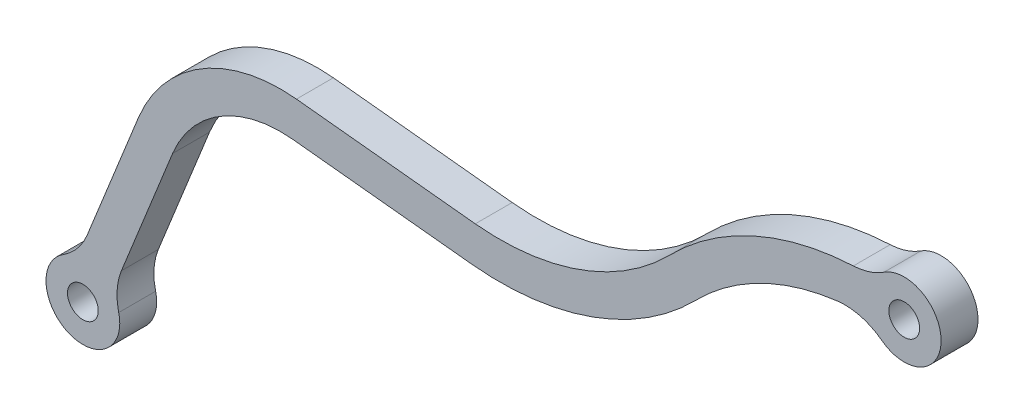
ISO-10303-21;
HEADER;
FILE_DESCRIPTION(('STEP AP214'),'2;1');
FILE_NAME('part.step','',(''),(''),'','','');
FILE_SCHEMA(('AUTOMOTIVE_DESIGN { 1 0 10303 214 1 1 1 1 }'));
ENDSEC;
DATA;
#1=APPLICATION_CONTEXT('core data for automotive mechanical design processes');
#2=APPLICATION_PROTOCOL_DEFINITION('international standard','automotive_design',2000,#1);
#3=PRODUCT_CONTEXT('',#1,'mechanical');
#4=PRODUCT('Part','Part','',(#3));
#5=PRODUCT_RELATED_PRODUCT_CATEGORY('part','',(#4));
#6=PRODUCT_DEFINITION_FORMATION('','',#4);
#7=PRODUCT_DEFINITION_CONTEXT('part definition',#1,'design');
#8=PRODUCT_DEFINITION('design','',#6,#7);
#9=PRODUCT_DEFINITION_SHAPE('','',#8);
#10=(LENGTH_UNIT() NAMED_UNIT(*) SI_UNIT(.MILLI.,.METRE.));
#11=(NAMED_UNIT(*) PLANE_ANGLE_UNIT() SI_UNIT($,.RADIAN.));
#12=(NAMED_UNIT(*) SI_UNIT($,.STERADIAN.) SOLID_ANGLE_UNIT());
#13=UNCERTAINTY_MEASURE_WITH_UNIT(LENGTH_MEASURE(1.E-05),#10,'distance_accuracy_value','');
#14=(GEOMETRIC_REPRESENTATION_CONTEXT(3) GLOBAL_UNCERTAINTY_ASSIGNED_CONTEXT((#13)) GLOBAL_UNIT_ASSIGNED_CONTEXT((#10,
#11,#12)) REPRESENTATION_CONTEXT('',''));
#15=CARTESIAN_POINT('',(0.,0.,0.));
#16=DIRECTION('',(0.,0.,1.));
#17=DIRECTION('',(1.,0.,0.));
#18=AXIS2_PLACEMENT_3D('',#15,#16,#17);
#19=CARTESIAN_POINT('',(64.3610891133232,12.0465142297136,3.));
#20=DIRECTION('',(0.,0.,-1.));
#21=DIRECTION('',(-1.,0.,0.));
#22=AXIS2_PLACEMENT_3D('',#19,#20,#21);
#23=CYLINDRICAL_SURFACE('',#22,19.3674957832383);
#24=CARTESIAN_POINT('',(64.3610891133232,12.0465142297136,0.));
#25=DIRECTION('',(0.,0.,1.));
#26=DIRECTION('',(1.,0.,0.));
#27=AXIS2_PLACEMENT_3D('',#24,#25,#26);
#28=CIRCLE('',#27,19.3674957832383);
#29=CARTESIAN_POINT('',(62.0017364179631,31.2697644172508,0.));
#30=VERTEX_POINT('',#29);
#31=CARTESIAN_POINT('',(50.5184496293153,25.5920383993254,0.));
#32=VERTEX_POINT('',#31);
#33=EDGE_CURVE('E208',#30,#32,#28,.T.);
#34=ORIENTED_EDGE('',*,*,#33,.F.);
#35=DIRECTION('',(0.,0.,-1.));
#36=VECTOR('',#35,1.);
#37=CARTESIAN_POINT('',(62.0017364179631,31.2697644172508,3.));
#38=LINE('',#37,#36);
#39=CARTESIAN_POINT('',(62.0017364179631,31.2697644172508,3.));
#40=VERTEX_POINT('',#39);
#41=EDGE_CURVE('E161',#30,#40,#38,.F.);
#42=ORIENTED_EDGE('',*,*,#41,.T.);
#43=CARTESIAN_POINT('',(64.3610891133232,12.0465142297136,3.));
#44=DIRECTION('',(0.,0.,1.));
#45=DIRECTION('',(1.,0.,0.));
#46=AXIS2_PLACEMENT_3D('',#43,#44,#45);
#47=CIRCLE('',#46,19.3674957832383);
#48=CARTESIAN_POINT('',(50.5184496293153,25.5920383993254,3.));
#49=VERTEX_POINT('',#48);
#50=EDGE_CURVE('E185',#40,#49,#47,.T.);
#51=ORIENTED_EDGE('',*,*,#50,.T.);
#52=DIRECTION('',(0.,0.,-1.));
#53=VECTOR('',#52,1.);
#54=CARTESIAN_POINT('',(50.5184496293153,25.5920383993254,3.));
#55=LINE('',#54,#53);
#56=EDGE_CURVE('E229',#49,#32,#55,.T.);
#57=ORIENTED_EDGE('',*,*,#56,.T.);
#58=EDGE_LOOP('',(#34,#42,#51,#57));
#59=FACE_BOUND('',#58,.T.);
#60=ADVANCED_FACE('F36',(#59),#23,.F.);
#61=CARTESIAN_POINT('',(64.3610891133232,12.0465142297136,3.));
#62=DIRECTION('',(0.,0.,-1.));
#63=DIRECTION('',(-1.,0.,0.));
#64=AXIS2_PLACEMENT_3D('',#61,#62,#63);
#65=CYLINDRICAL_SURFACE('',#64,22.3674957832383);
#66=CARTESIAN_POINT('',(64.3610891133232,12.0465142297136,3.));
#67=DIRECTION('',(0.,0.,1.));
#68=DIRECTION('',(1.,0.,0.));
#69=AXIS2_PLACEMENT_3D('',#66,#67,#68);
#70=CIRCLE('',#69,22.3674957832383);
#71=CARTESIAN_POINT('',(63.3006952292982,34.3888604006936,3.));
#72=VERTEX_POINT('',#71);
#73=CARTESIAN_POINT('',(48.3742427108367,27.6902225406125,3.));
#74=VERTEX_POINT('',#73);
#75=EDGE_CURVE('E187',#72,#74,#70,.T.);
#76=ORIENTED_EDGE('',*,*,#75,.F.);
#77=DIRECTION('',(0.,0.,-1.));
#78=VECTOR('',#77,1.);
#79=CARTESIAN_POINT('',(63.3006952292982,34.3888604006936,3.));
#80=LINE('',#79,#78);
#81=CARTESIAN_POINT('',(63.3006952292982,34.3888604006936,0.));
#82=VERTEX_POINT('',#81);
#83=EDGE_CURVE('E242',#72,#82,#80,.T.);
#84=ORIENTED_EDGE('',*,*,#83,.T.);
#85=CARTESIAN_POINT('',(64.3610891133232,12.0465142297136,0.));
#86=DIRECTION('',(0.,0.,1.));
#87=DIRECTION('',(1.,0.,0.));
#88=AXIS2_PLACEMENT_3D('',#85,#86,#87);
#89=CIRCLE('',#88,22.3674957832383);
#90=CARTESIAN_POINT('',(48.3742427108367,27.6902225406125,0.));
#91=VERTEX_POINT('',#90);
#92=EDGE_CURVE('E210',#82,#91,#89,.T.);
#93=ORIENTED_EDGE('',*,*,#92,.T.);
#94=DIRECTION('',(0.,0.,-1.));
#95=VECTOR('',#94,1.);
#96=CARTESIAN_POINT('',(48.3742427108367,27.6902225406125,3.));
#97=LINE('',#96,#95);
#98=EDGE_CURVE('E226',#74,#91,#97,.T.);
#99=ORIENTED_EDGE('',*,*,#98,.F.);
#100=EDGE_LOOP('',(#76,#84,#93,#99));
#101=FACE_BOUND('',#100,.T.);
#102=ADVANCED_FACE('F287',(#101),#65,.T.);
#103=CARTESIAN_POINT('',(5.16671569963093,15.7549925129079,3.));
#104=DIRECTION('',(0.927645319877807,-0.373462395039715,0.));
#105=DIRECTION('',(0.373462395039715,0.927645319877808,0.));
#106=AXIS2_PLACEMENT_3D('',#103,#104,#105);
#107=PLANE('',#106);
#108=DIRECTION('',(-0.373462395039715,-0.927645319877808,0.));
#109=VECTOR('',#108,1.);
#110=CARTESIAN_POINT('',(5.16671569963093,15.7549925129079,0.));
#111=LINE('',#110,#109);
#112=CARTESIAN_POINT('',(5.16671569963093,15.7549925129079,0.));
#113=VERTEX_POINT('',#112);
#114=CARTESIAN_POINT('',(1.0039127510955,5.41498311953436,0.));
#115=VERTEX_POINT('',#114);
#116=EDGE_CURVE('E196',#113,#115,#111,.T.);
#117=ORIENTED_EDGE('',*,*,#116,.T.);
#118=DIRECTION('',(0.,0.,1.));
#119=VECTOR('',#118,1.);
#120=CARTESIAN_POINT('',(1.0039127510955,5.41498311953436,3.));
#121=LINE('',#120,#119);
#122=CARTESIAN_POINT('',(1.0039127510955,5.41498311953436,3.));
#123=VERTEX_POINT('',#122);
#124=EDGE_CURVE('E57',#115,#123,#121,.T.);
#125=ORIENTED_EDGE('',*,*,#124,.T.);
#126=DIRECTION('',(-0.373462395039715,-0.927645319877808,0.));
#127=VECTOR('',#126,1.);
#128=CARTESIAN_POINT('',(5.16671569963093,15.7549925129079,3.));
#129=LINE('',#128,#127);
#130=CARTESIAN_POINT('',(5.16671569963093,15.7549925129079,3.));
#131=VERTEX_POINT('',#130);
#132=EDGE_CURVE('E174',#131,#123,#129,.T.);
#133=ORIENTED_EDGE('',*,*,#132,.F.);
#134=DIRECTION('',(0.,0.,-1.));
#135=VECTOR('',#134,1.);
#136=CARTESIAN_POINT('',(5.16671569963093,15.7549925129079,3.));
#137=LINE('',#136,#135);
#138=EDGE_CURVE('E195',#131,#113,#137,.T.);
#139=ORIENTED_EDGE('',*,*,#138,.T.);
#140=EDGE_LOOP('',(#117,#125,#133,#139));
#141=FACE_BOUND('',#140,.T.);
#142=ADVANCED_FACE('F293',(#141),#107,.F.);
#143=CARTESIAN_POINT('',(7.94965165926435,14.6346053277887,3.));
#144=DIRECTION('',(0.927645319877807,-0.373462395039715,0.));
#145=DIRECTION('',(0.373462395039715,0.927645319877808,0.));
#146=AXIS2_PLACEMENT_3D('',#143,#144,#145);
#147=PLANE('',#146);
#148=DIRECTION('',(-0.373462395039715,-0.927645319877808,0.));
#149=VECTOR('',#148,1.);
#150=CARTESIAN_POINT('',(7.94965165926435,14.6346053277887,3.));
#151=LINE('',#150,#149);
#152=CARTESIAN_POINT('',(7.94965165926435,14.6346053277887,3.));
#153=VERTEX_POINT('',#152);
#154=CARTESIAN_POINT('',(3.78684871072892,4.29459593441521,3.));
#155=VERTEX_POINT('',#154);
#156=EDGE_CURVE('E153',#153,#155,#151,.T.);
#157=ORIENTED_EDGE('',*,*,#156,.T.);
#158=DIRECTION('',(0.,0.,-1.));
#159=VECTOR('',#158,1.);
#160=CARTESIAN_POINT('',(3.78684871072892,4.29459593441521,3.));
#161=LINE('',#160,#159);
#162=CARTESIAN_POINT('',(3.78684871072892,4.29459593441521,0.));
#163=VERTEX_POINT('',#162);
#164=EDGE_CURVE('E244',#155,#163,#161,.T.);
#165=ORIENTED_EDGE('',*,*,#164,.T.);
#166=DIRECTION('',(-0.373462395039715,-0.927645319877808,0.));
#167=VECTOR('',#166,1.);
#168=CARTESIAN_POINT('',(7.94965165926435,14.6346053277887,0.));
#169=LINE('',#168,#167);
#170=CARTESIAN_POINT('',(7.94965165926435,14.6346053277887,0.));
#171=VERTEX_POINT('',#170);
#172=EDGE_CURVE('E156',#171,#163,#169,.T.);
#173=ORIENTED_EDGE('',*,*,#172,.F.);
#174=DIRECTION('',(0.,0.,-1.));
#175=VECTOR('',#174,1.);
#176=CARTESIAN_POINT('',(7.94965165926435,14.6346053277887,3.));
#177=LINE('',#176,#175);
#178=EDGE_CURVE('E149',#153,#171,#177,.T.);
#179=ORIENTED_EDGE('',*,*,#178,.F.);
#180=EDGE_LOOP('',(#157,#165,#173,#179));
#181=FACE_BOUND('',#180,.T.);
#182=ADVANCED_FACE('F151',(#181),#147,.T.);
#183=CARTESIAN_POINT('',(16.7293976918901,11.0999516073164,3.));
#184=DIRECTION('',(0.,0.,-1.));
#185=DIRECTION('',(-1.,0.,0.));
#186=AXIS2_PLACEMENT_3D('',#183,#184,#185);
#187=CYLINDRICAL_SURFACE('',#186,9.46455056096464);
#188=CARTESIAN_POINT('',(16.7293976918901,11.0999516073164,0.));
#189=DIRECTION('',(0.,0.,1.));
#190=DIRECTION('',(1.,0.,0.));
#191=AXIS2_PLACEMENT_3D('',#188,#189,#190);
#192=CIRCLE('',#191,9.46455056096464);
#193=CARTESIAN_POINT('',(17.7089322995858,20.5136771861392,0.));
#194=VERTEX_POINT('',#193);
#195=EDGE_CURVE('E200',#194,#171,#192,.T.);
#196=ORIENTED_EDGE('',*,*,#195,.F.);
#197=DIRECTION('',(0.,0.,-1.));
#198=VECTOR('',#197,1.);
#199=CARTESIAN_POINT('',(17.7089322995858,20.5136771861392,3.));
#200=LINE('',#199,#198);
#201=CARTESIAN_POINT('',(17.7089322995858,20.5136771861392,3.));
#202=VERTEX_POINT('',#201);
#203=EDGE_CURVE('E162',#202,#194,#200,.T.);
#204=ORIENTED_EDGE('',*,*,#203,.F.);
#205=CARTESIAN_POINT('',(16.7293976918901,11.0999516073164,3.));
#206=DIRECTION('',(0.,0.,1.));
#207=DIRECTION('',(1.,0.,0.));
#208=AXIS2_PLACEMENT_3D('',#205,#206,#207);
#209=CIRCLE('',#208,9.46455056096464);
#210=EDGE_CURVE('E169',#202,#153,#209,.T.);
#211=ORIENTED_EDGE('',*,*,#210,.T.);
#212=ORIENTED_EDGE('',*,*,#178,.T.);
#213=EDGE_LOOP('',(#196,#204,#211,#212));
#214=FACE_BOUND('',#213,.T.);
#215=ADVANCED_FACE('F176',(#214),#187,.F.);
#216=CARTESIAN_POINT('',(32.2505031981762,19.0005704117635,3.));
#217=DIRECTION('',(-0.103495100098643,-0.994629963481682,0.));
#218=DIRECTION('',(0.994629963481682,-0.103495100098643,0.));
#219=AXIS2_PLACEMENT_3D('',#216,#217,#218);
#220=PLANE('',#219);
#221=DIRECTION('',(-0.994629963481682,0.103495100098643,0.));
#222=VECTOR('',#221,1.);
#223=CARTESIAN_POINT('',(32.2505031981762,19.0005704117635,0.));
#224=LINE('',#223,#222);
#225=CARTESIAN_POINT('',(32.2505031981762,19.0005704117635,0.));
#226=VERTEX_POINT('',#225);
#227=EDGE_CURVE('E202',#226,#194,#224,.T.);
#228=ORIENTED_EDGE('',*,*,#227,.F.);
#229=DIRECTION('',(0.,0.,-1.));
#230=VECTOR('',#229,1.);
#231=CARTESIAN_POINT('',(32.2505031981762,19.0005704117635,3.));
#232=LINE('',#231,#230);
#233=CARTESIAN_POINT('',(32.2505031981762,19.0005704117635,3.));
#234=VERTEX_POINT('',#233);
#235=EDGE_CURVE('E232',#234,#226,#232,.T.);
#236=ORIENTED_EDGE('',*,*,#235,.F.);
#237=DIRECTION('',(-0.994629963481682,0.103495100098643,0.));
#238=VECTOR('',#237,1.);
#239=CARTESIAN_POINT('',(32.2505031981762,19.0005704117635,3.));
#240=LINE('',#239,#238);
#241=EDGE_CURVE('E177',#234,#202,#240,.T.);
#242=ORIENTED_EDGE('',*,*,#241,.T.);
#243=ORIENTED_EDGE('',*,*,#203,.T.);
#244=EDGE_LOOP('',(#228,#236,#242,#243));
#245=FACE_BOUND('',#244,.T.);
#246=ADVANCED_FACE('F303',(#245),#220,.T.);
#247=CARTESIAN_POINT('',(34.5611508590442,41.2068332817708,3.));
#248=DIRECTION('',(0.,0.,-1.));
#249=DIRECTION('',(-1.,0.,0.));
#250=AXIS2_PLACEMENT_3D('',#247,#248,#249);
#251=CYLINDRICAL_SURFACE('',#250,22.3261551384142);
#252=CARTESIAN_POINT('',(34.5611508590442,41.2068332817708,0.));
#253=DIRECTION('',(0.,0.,1.));
#254=DIRECTION('',(1.,0.,0.));
#255=AXIS2_PLACEMENT_3D('',#252,#253,#254);
#256=CIRCLE('',#255,22.3261551384142);
#257=EDGE_CURVE('E205',#32,#226,#256,.F.);
#258=ORIENTED_EDGE('',*,*,#257,.F.);
#259=ORIENTED_EDGE('',*,*,#56,.F.);
#260=CARTESIAN_POINT('',(34.5611508590442,41.2068332817708,3.));
#261=DIRECTION('',(0.,0.,1.));
#262=DIRECTION('',(1.,0.,0.));
#263=AXIS2_PLACEMENT_3D('',#260,#261,#262);
#264=CIRCLE('',#263,22.3261551384142);
#265=EDGE_CURVE('E179',#49,#234,#264,.F.);
#266=ORIENTED_EDGE('',*,*,#265,.T.);
#267=ORIENTED_EDGE('',*,*,#235,.T.);
#268=EDGE_LOOP('',(#258,#259,#266,#267));
#269=FACE_BOUND('',#268,.T.);
#270=ADVANCED_FACE('F299',(#269),#251,.T.);
#271=CARTESIAN_POINT('',(34.5611508590442,41.2068332817708,3.));
#272=DIRECTION('',(0.,0.,-1.));
#273=DIRECTION('',(-1.,0.,0.));
#274=AXIS2_PLACEMENT_3D('',#271,#272,#273);
#275=CYLINDRICAL_SURFACE('',#274,19.3261551384142);
#276=CARTESIAN_POINT('',(34.5611508590442,41.2068332817708,0.));
#277=DIRECTION('',(0.,0.,1.));
#278=DIRECTION('',(1.,0.,0.));
#279=AXIS2_PLACEMENT_3D('',#276,#277,#278);
#280=CIRCLE('',#279,19.3261551384142);
#281=CARTESIAN_POINT('',(32.5609884984721,21.9844603022086,0.));
#282=VERTEX_POINT('',#281);
#283=EDGE_CURVE('E212',#91,#282,#280,.F.);
#284=ORIENTED_EDGE('',*,*,#283,.T.);
#285=DIRECTION('',(0.,0.,-1.));
#286=VECTOR('',#285,1.);
#287=CARTESIAN_POINT('',(32.5609884984721,21.9844603022086,3.));
#288=LINE('',#287,#286);
#289=CARTESIAN_POINT('',(32.5609884984721,21.9844603022086,3.));
#290=VERTEX_POINT('',#289);
#291=EDGE_CURVE('E223',#290,#282,#288,.T.);
#292=ORIENTED_EDGE('',*,*,#291,.F.);
#293=CARTESIAN_POINT('',(34.5611508590442,41.2068332817708,3.));
#294=DIRECTION('',(0.,0.,1.));
#295=DIRECTION('',(1.,0.,0.));
#296=AXIS2_PLACEMENT_3D('',#293,#294,#295);
#297=CIRCLE('',#296,19.3261551384142);
#298=EDGE_CURVE('E189',#74,#290,#297,.F.);
#299=ORIENTED_EDGE('',*,*,#298,.F.);
#300=ORIENTED_EDGE('',*,*,#98,.T.);
#301=EDGE_LOOP('',(#284,#292,#299,#300));
#302=FACE_BOUND('',#301,.T.);
#303=ADVANCED_FACE('F302',(#302),#275,.F.);
#304=CARTESIAN_POINT('',(32.5609884984721,21.9844603022086,3.));
#305=DIRECTION('',(-0.103495100098643,-0.994629963481682,0.));
#306=DIRECTION('',(0.994629963481682,-0.103495100098643,0.));
#307=AXIS2_PLACEMENT_3D('',#304,#305,#306);
#308=PLANE('',#307);
#309=DIRECTION('',(-0.994629963481682,0.103495100098643,0.));
#310=VECTOR('',#309,1.);
#311=CARTESIAN_POINT('',(32.5609884984721,21.9844603022086,0.));
#312=LINE('',#311,#310);
#313=CARTESIAN_POINT('',(18.0194175998817,23.4975670765842,0.));
#314=VERTEX_POINT('',#313);
#315=EDGE_CURVE('E214',#282,#314,#312,.T.);
#316=ORIENTED_EDGE('',*,*,#315,.T.);
#317=DIRECTION('',(0.,0.,-1.));
#318=VECTOR('',#317,1.);
#319=CARTESIAN_POINT('',(18.0194175998817,23.4975670765842,3.));
#320=LINE('',#319,#318);
#321=CARTESIAN_POINT('',(18.0194175998817,23.4975670765842,3.));
#322=VERTEX_POINT('',#321);
#323=EDGE_CURVE('E220',#322,#314,#320,.T.);
#324=ORIENTED_EDGE('',*,*,#323,.F.);
#325=DIRECTION('',(-0.994629963481682,0.103495100098643,0.));
#326=VECTOR('',#325,1.);
#327=CARTESIAN_POINT('',(32.5609884984721,21.9844603022086,3.));
#328=LINE('',#327,#326);
#329=EDGE_CURVE('E191',#290,#322,#328,.T.);
#330=ORIENTED_EDGE('',*,*,#329,.F.);
#331=ORIENTED_EDGE('',*,*,#291,.T.);
#332=EDGE_LOOP('',(#316,#324,#330,#331));
#333=FACE_BOUND('',#332,.T.);
#334=ADVANCED_FACE('F352',(#333),#308,.F.);
#335=CARTESIAN_POINT('',(16.7293976918901,11.0999516073164,3.));
#336=DIRECTION('',(0.,0.,-1.));
#337=DIRECTION('',(-1.,0.,0.));
#338=AXIS2_PLACEMENT_3D('',#335,#336,#337);
#339=CYLINDRICAL_SURFACE('',#338,12.4645505609646);
#340=CARTESIAN_POINT('',(16.7293976918901,11.0999516073164,0.));
#341=DIRECTION('',(0.,0.,1.));
#342=DIRECTION('',(1.,0.,0.));
#343=AXIS2_PLACEMENT_3D('',#340,#341,#342);
#344=CIRCLE('',#343,12.4645505609646);
#345=EDGE_CURVE('E216',#314,#113,#344,.T.);
#346=ORIENTED_EDGE('',*,*,#345,.T.);
#347=ORIENTED_EDGE('',*,*,#138,.F.);
#348=CARTESIAN_POINT('',(16.7293976918901,11.0999516073164,3.));
#349=DIRECTION('',(0.,0.,1.));
#350=DIRECTION('',(1.,0.,0.));
#351=AXIS2_PLACEMENT_3D('',#348,#349,#350);
#352=CIRCLE('',#351,12.4645505609646);
#353=EDGE_CURVE('E193',#322,#131,#352,.T.);
#354=ORIENTED_EDGE('',*,*,#353,.F.);
#355=ORIENTED_EDGE('',*,*,#323,.T.);
#356=EDGE_LOOP('',(#346,#347,#354,#355));
#357=FACE_BOUND('',#356,.T.);
#358=ADVANCED_FACE('F348',(#357),#339,.T.);
#359=CARTESIAN_POINT('',(16.7293976918901,11.0999516073164,3.));
#360=DIRECTION('',(0.,0.,1.));
#361=DIRECTION('',(1.,0.,0.));
#362=AXIS2_PLACEMENT_3D('',#359,#360,#361);
#363=PLANE('',#362);
#364=CARTESIAN_POINT('',(67.439025257705,32.6857654117351,3.));
#365=DIRECTION('',(0.,0.,1.));
#366=DIRECTION('',(1.,0.,0.));
#367=AXIS2_PLACEMENT_3D('',#364,#365,#366);
#368=CIRCLE('',#367,1.25);
#369=CARTESIAN_POINT('',(68.689025257705,32.6857654117351,3.));
#370=VERTEX_POINT('',#369);
#371=EDGE_CURVE('E391',#370,#370,#368,.T.);
#372=ORIENTED_EDGE('',*,*,#371,.F.);
#373=EDGE_LOOP('',(#372));
#374=FACE_BOUND('',#373,.T.);
#375=CARTESIAN_POINT('',(0.653668070607294,0.528539764312714,3.));
#376=DIRECTION('',(0.,0.,1.));
#377=DIRECTION('',(1.,0.,0.));
#378=AXIS2_PLACEMENT_3D('',#375,#376,#377);
#379=CIRCLE('',#378,1.25);
#380=CARTESIAN_POINT('',(1.90366807060729,0.528539764312714,3.));
#381=VERTEX_POINT('',#380);
#382=EDGE_CURVE('E338',#381,#381,#379,.T.);
#383=ORIENTED_EDGE('',*,*,#382,.F.);
#384=EDGE_LOOP('',(#383));
#385=FACE_BOUND('',#384,.T.);
#386=ORIENTED_EDGE('',*,*,#50,.F.);
#387=CARTESIAN_POINT('',(62.6108375433141,26.3070035103467,3.));
#388=DIRECTION('',(0.,0.,1.));
#389=DIRECTION('',(1.,0.,0.));
#390=AXIS2_PLACEMENT_3D('',#387,#388,#389);
#391=CIRCLE('',#390,5.);
#392=CARTESIAN_POINT('',(65.6284548648084,30.2937296987144,3.));
#393=VERTEX_POINT('',#392);
#394=EDGE_CURVE('E252',#40,#393,#391,.F.);
#395=ORIENTED_EDGE('',*,*,#394,.T.);
#396=CARTESIAN_POINT('',(67.439025257705,32.6857654117351,3.));
#397=DIRECTION('',(0.,0.,1.));
#398=DIRECTION('',(1.,0.,0.));
#399=AXIS2_PLACEMENT_3D('',#396,#397,#398);
#400=CIRCLE('',#399,3.00000000000001);
#401=CARTESIAN_POINT('',(65.7982618622084,35.1973178161254,3.));
#402=VERTEX_POINT('',#401);
#403=EDGE_CURVE('E332',#393,#402,#400,.T.);
#404=ORIENTED_EDGE('',*,*,#403,.T.);
#405=CARTESIAN_POINT('',(63.0636562030475,39.3832384901092,3.));
#406=DIRECTION('',(0.,0.,1.));
#407=DIRECTION('',(1.,0.,0.));
#408=AXIS2_PLACEMENT_3D('',#405,#406,#407);
#409=CIRCLE('',#408,5.);
#410=EDGE_CURVE('E256',#402,#72,#409,.F.);
#411=ORIENTED_EDGE('',*,*,#410,.T.);
#412=ORIENTED_EDGE('',*,*,#75,.T.);
#413=ORIENTED_EDGE('',*,*,#298,.T.);
#414=ORIENTED_EDGE('',*,*,#329,.T.);
#415=ORIENTED_EDGE('',*,*,#353,.T.);
#416=ORIENTED_EDGE('',*,*,#132,.T.);
#417=CARTESIAN_POINT('',(-3.63431384829353,7.28229509473294,3.));
#418=DIRECTION('',(0.,0.,1.));
#419=DIRECTION('',(1.,0.,0.));
#420=AXIS2_PLACEMENT_3D('',#417,#418,#419);
#421=CIRCLE('',#420,5.);
#422=CARTESIAN_POINT('',(-0.954325148980511,3.0611980132203,3.));
#423=VERTEX_POINT('',#422);
#424=EDGE_CURVE('E11',#123,#423,#421,.F.);
#425=ORIENTED_EDGE('',*,*,#424,.T.);
#426=CARTESIAN_POINT('',(0.6536680706073,0.528539764312716,3.));
#427=DIRECTION('',(0.,0.,1.));
#428=DIRECTION('',(1.,0.,0.));
#429=AXIS2_PLACEMENT_3D('',#426,#427,#428);
#430=CIRCLE('',#429,3.);
#431=CARTESIAN_POINT('',(3.5679457854238,1.24056883740169,3.));
#432=VERTEX_POINT('',#431);
#433=EDGE_CURVE('E198',#423,#432,#430,.T.);
#434=ORIENTED_EDGE('',*,*,#433,.T.);
#435=CARTESIAN_POINT('',(8.42507531011796,2.42728395921664,3.));
#436=DIRECTION('',(0.,0.,1.));
#437=DIRECTION('',(1.,0.,0.));
#438=AXIS2_PLACEMENT_3D('',#435,#436,#437);
#439=CIRCLE('',#438,5.);
#440=EDGE_CURVE('E173',#432,#155,#439,.F.);
#441=ORIENTED_EDGE('',*,*,#440,.T.);
#442=ORIENTED_EDGE('',*,*,#156,.F.);
#443=ORIENTED_EDGE('',*,*,#210,.F.);
#444=ORIENTED_EDGE('',*,*,#241,.F.);
#445=ORIENTED_EDGE('',*,*,#265,.F.);
#446=EDGE_LOOP('',(#386,#395,#404,#411,#412,#413,#414,#415,#416,#425,#434,#441,#442,#443,#444,#445));
#447=FACE_BOUND('',#446,.T.);
#448=ADVANCED_FACE('F167',(#374,#385,#447),#363,.T.);
#449=CARTESIAN_POINT('',(16.7293976918901,11.0999516073164,0.));
#450=DIRECTION('',(0.,0.,1.));
#451=DIRECTION('',(1.,0.,0.));
#452=AXIS2_PLACEMENT_3D('',#449,#450,#451);
#453=PLANE('',#452);
#454=CARTESIAN_POINT('',(67.439025257705,32.6857654117351,0.));
#455=DIRECTION('',(0.,0.,1.));
#456=DIRECTION('',(1.,0.,0.));
#457=AXIS2_PLACEMENT_3D('',#454,#455,#456);
#458=CIRCLE('',#457,1.25);
#459=CARTESIAN_POINT('',(68.689025257705,32.6857654117351,0.));
#460=VERTEX_POINT('',#459);
#461=EDGE_CURVE('E388',#460,#460,#458,.T.);
#462=ORIENTED_EDGE('',*,*,#461,.T.);
#463=EDGE_LOOP('',(#462));
#464=FACE_BOUND('',#463,.T.);
#465=CARTESIAN_POINT('',(0.653668070607294,0.528539764312714,0.));
#466=DIRECTION('',(0.,0.,1.));
#467=DIRECTION('',(1.,0.,0.));
#468=AXIS2_PLACEMENT_3D('',#465,#466,#467);
#469=CIRCLE('',#468,1.25);
#470=CARTESIAN_POINT('',(1.90366807060729,0.528539764312714,0.));
#471=VERTEX_POINT('',#470);
#472=EDGE_CURVE('E334',#471,#471,#469,.T.);
#473=ORIENTED_EDGE('',*,*,#472,.T.);
#474=EDGE_LOOP('',(#473));
#475=FACE_BOUND('',#474,.T.);
#476=CARTESIAN_POINT('',(67.439025257705,32.6857654117351,0.));
#477=DIRECTION('',(0.,0.,1.));
#478=DIRECTION('',(1.,0.,0.));
#479=AXIS2_PLACEMENT_3D('',#476,#477,#478);
#480=CIRCLE('',#479,3.00000000000001);
#481=CARTESIAN_POINT('',(65.6284548648084,30.2937296987144,0.));
#482=VERTEX_POINT('',#481);
#483=CARTESIAN_POINT('',(65.7982618622084,35.1973178161254,0.));
#484=VERTEX_POINT('',#483);
#485=EDGE_CURVE('E272',#482,#484,#480,.T.);
#486=ORIENTED_EDGE('',*,*,#485,.F.);
#487=CARTESIAN_POINT('',(62.6108375433141,26.3070035103467,0.));
#488=DIRECTION('',(0.,0.,1.));
#489=DIRECTION('',(1.,0.,0.));
#490=AXIS2_PLACEMENT_3D('',#487,#488,#489);
#491=CIRCLE('',#490,5.);
#492=EDGE_CURVE('E254',#482,#30,#491,.T.);
#493=ORIENTED_EDGE('',*,*,#492,.T.);
#494=ORIENTED_EDGE('',*,*,#33,.T.);
#495=ORIENTED_EDGE('',*,*,#257,.T.);
#496=ORIENTED_EDGE('',*,*,#227,.T.);
#497=ORIENTED_EDGE('',*,*,#195,.T.);
#498=ORIENTED_EDGE('',*,*,#172,.T.);
#499=CARTESIAN_POINT('',(8.42507531011796,2.42728395921664,0.));
#500=DIRECTION('',(0.,0.,1.));
#501=DIRECTION('',(1.,0.,0.));
#502=AXIS2_PLACEMENT_3D('',#499,#500,#501);
#503=CIRCLE('',#502,5.);
#504=CARTESIAN_POINT('',(3.5679457854238,1.24056883740169,0.));
#505=VERTEX_POINT('',#504);
#506=EDGE_CURVE('E260',#163,#505,#503,.T.);
#507=ORIENTED_EDGE('',*,*,#506,.T.);
#508=CARTESIAN_POINT('',(0.6536680706073,0.528539764312716,0.));
#509=DIRECTION('',(0.,0.,1.));
#510=DIRECTION('',(1.,0.,0.));
#511=AXIS2_PLACEMENT_3D('',#508,#509,#510);
#512=CIRCLE('',#511,3.);
#513=CARTESIAN_POINT('',(-0.954325148980511,3.0611980132203,0.));
#514=VERTEX_POINT('',#513);
#515=EDGE_CURVE('E265',#514,#505,#512,.T.);
#516=ORIENTED_EDGE('',*,*,#515,.F.);
#517=CARTESIAN_POINT('',(-3.63431384829353,7.28229509473294,0.));
#518=DIRECTION('',(0.,0.,1.));
#519=DIRECTION('',(1.,0.,0.));
#520=AXIS2_PLACEMENT_3D('',#517,#518,#519);
#521=CIRCLE('',#520,5.);
#522=EDGE_CURVE('E44',#514,#115,#521,.T.);
#523=ORIENTED_EDGE('',*,*,#522,.T.);
#524=ORIENTED_EDGE('',*,*,#116,.F.);
#525=ORIENTED_EDGE('',*,*,#345,.F.);
#526=ORIENTED_EDGE('',*,*,#315,.F.);
#527=ORIENTED_EDGE('',*,*,#283,.F.);
#528=ORIENTED_EDGE('',*,*,#92,.F.);
#529=CARTESIAN_POINT('',(63.0636562030475,39.3832384901092,0.));
#530=DIRECTION('',(0.,0.,1.));
#531=DIRECTION('',(1.,0.,0.));
#532=AXIS2_PLACEMENT_3D('',#529,#530,#531);
#533=CIRCLE('',#532,5.);
#534=EDGE_CURVE('E258',#82,#484,#533,.T.);
#535=ORIENTED_EDGE('',*,*,#534,.T.);
#536=EDGE_LOOP('',(#486,#493,#494,#495,#496,#497,#498,#507,#516,#523,#524,#525,#526,#527,#528,#535));
#537=FACE_BOUND('',#536,.T.);
#538=ADVANCED_FACE('F264',(#464,#475,#537),#453,.F.);
#539=CARTESIAN_POINT('',(0.6536680706073,0.528539764312716,3.));
#540=DIRECTION('',(0.,0.,-1.));
#541=DIRECTION('',(-1.,0.,0.));
#542=AXIS2_PLACEMENT_3D('',#539,#540,#541);
#543=CYLINDRICAL_SURFACE('',#542,3.);
#544=ORIENTED_EDGE('',*,*,#515,.T.);
#545=DIRECTION('',(0.,0.,-1.));
#546=VECTOR('',#545,1.);
#547=CARTESIAN_POINT('',(3.5679457854238,1.24056883740169,3.));
#548=LINE('',#547,#546);
#549=EDGE_CURVE('E249',#505,#432,#548,.F.);
#550=ORIENTED_EDGE('',*,*,#549,.T.);
#551=ORIENTED_EDGE('',*,*,#433,.F.);
#552=DIRECTION('',(0.,0.,-1.));
#553=VECTOR('',#552,1.);
#554=CARTESIAN_POINT('',(-0.954325148980511,3.0611980132203,3.));
#555=LINE('',#554,#553);
#556=EDGE_CURVE('E246',#423,#514,#555,.T.);
#557=ORIENTED_EDGE('',*,*,#556,.T.);
#558=EDGE_LOOP('',(#544,#550,#551,#557));
#559=FACE_BOUND('',#558,.T.);
#560=ADVANCED_FACE('F269',(#559),#543,.T.);
#561=CARTESIAN_POINT('',(67.439025257705,32.6857654117351,3.));
#562=DIRECTION('',(0.,0.,-1.));
#563=DIRECTION('',(-1.,0.,0.));
#564=AXIS2_PLACEMENT_3D('',#561,#562,#563);
#565=CYLINDRICAL_SURFACE('',#564,3.00000000000001);
#566=ORIENTED_EDGE('',*,*,#403,.F.);
#567=DIRECTION('',(0.,0.,-1.));
#568=VECTOR('',#567,1.);
#569=CARTESIAN_POINT('',(65.6284548648084,30.2937296987144,3.));
#570=LINE('',#569,#568);
#571=EDGE_CURVE('E240',#393,#482,#570,.T.);
#572=ORIENTED_EDGE('',*,*,#571,.T.);
#573=ORIENTED_EDGE('',*,*,#485,.T.);
#574=DIRECTION('',(0.,0.,-1.));
#575=VECTOR('',#574,1.);
#576=CARTESIAN_POINT('',(65.7982618622084,35.1973178161254,3.));
#577=LINE('',#576,#575);
#578=EDGE_CURVE('E237',#484,#402,#577,.F.);
#579=ORIENTED_EDGE('',*,*,#578,.T.);
#580=EDGE_LOOP('',(#566,#572,#573,#579));
#581=FACE_BOUND('',#580,.T.);
#582=ADVANCED_FACE('F315',(#581),#565,.T.);
#583=CARTESIAN_POINT('',(62.6108375433141,26.3070035103467,3.));
#584=DIRECTION('',(0.,0.,1.));
#585=DIRECTION('',(1.,0.,0.));
#586=AXIS2_PLACEMENT_3D('',#583,#584,#585);
#587=CYLINDRICAL_SURFACE('',#586,5.);
#588=ORIENTED_EDGE('',*,*,#492,.F.);
#589=ORIENTED_EDGE('',*,*,#571,.F.);
#590=ORIENTED_EDGE('',*,*,#394,.F.);
#591=ORIENTED_EDGE('',*,*,#41,.F.);
#592=EDGE_LOOP('',(#588,#589,#590,#591));
#593=FACE_BOUND('',#592,.T.);
#594=ADVANCED_FACE('F283',(#593),#587,.F.);
#595=CARTESIAN_POINT('',(63.0636562030475,39.3832384901092,3.));
#596=DIRECTION('',(0.,0.,-1.));
#597=DIRECTION('',(-1.,0.,0.));
#598=AXIS2_PLACEMENT_3D('',#595,#596,#597);
#599=CYLINDRICAL_SURFACE('',#598,5.);
#600=ORIENTED_EDGE('',*,*,#534,.F.);
#601=ORIENTED_EDGE('',*,*,#83,.F.);
#602=ORIENTED_EDGE('',*,*,#410,.F.);
#603=ORIENTED_EDGE('',*,*,#578,.F.);
#604=EDGE_LOOP('',(#600,#601,#602,#603));
#605=FACE_BOUND('',#604,.T.);
#606=ADVANCED_FACE('F276',(#605),#599,.F.);
#607=CARTESIAN_POINT('',(8.42507531011796,2.42728395921664,3.));
#608=DIRECTION('',(0.,0.,-1.));
#609=DIRECTION('',(-1.,0.,0.));
#610=AXIS2_PLACEMENT_3D('',#607,#608,#609);
#611=CYLINDRICAL_SURFACE('',#610,5.);
#612=ORIENTED_EDGE('',*,*,#440,.F.);
#613=ORIENTED_EDGE('',*,*,#549,.F.);
#614=ORIENTED_EDGE('',*,*,#506,.F.);
#615=ORIENTED_EDGE('',*,*,#164,.F.);
#616=EDGE_LOOP('',(#612,#613,#614,#615));
#617=FACE_BOUND('',#616,.T.);
#618=ADVANCED_FACE('F274',(#617),#611,.F.);
#619=CARTESIAN_POINT('',(-3.63431384829353,7.28229509473294,3.));
#620=DIRECTION('',(0.,0.,-1.));
#621=DIRECTION('',(-1.,0.,0.));
#622=AXIS2_PLACEMENT_3D('',#619,#620,#621);
#623=CYLINDRICAL_SURFACE('',#622,5.);
#624=ORIENTED_EDGE('',*,*,#424,.F.);
#625=ORIENTED_EDGE('',*,*,#124,.F.);
#626=ORIENTED_EDGE('',*,*,#522,.F.);
#627=ORIENTED_EDGE('',*,*,#556,.F.);
#628=EDGE_LOOP('',(#624,#625,#626,#627));
#629=FACE_BOUND('',#628,.T.);
#630=ADVANCED_FACE('F38',(#629),#623,.F.);
#631=CARTESIAN_POINT('',(0.653668070607294,0.528539764312714,3.));
#632=DIRECTION('',(0.,0.,1.));
#633=DIRECTION('',(1.,0.,0.));
#634=AXIS2_PLACEMENT_3D('',#631,#632,#633);
#635=CYLINDRICAL_SURFACE('',#634,1.25);
#636=ORIENTED_EDGE('',*,*,#472,.F.);
#637=EDGE_LOOP('',(#636));
#638=FACE_BOUND('',#637,.T.);
#639=ORIENTED_EDGE('',*,*,#382,.T.);
#640=EDGE_LOOP('',(#639));
#641=FACE_BOUND('',#640,.T.);
#642=ADVANCED_FACE('F281',(#638,#641),#635,.F.);
#643=CARTESIAN_POINT('',(67.439025257705,32.6857654117351,3.));
#644=DIRECTION('',(0.,0.,1.));
#645=DIRECTION('',(1.,0.,0.));
#646=AXIS2_PLACEMENT_3D('',#643,#644,#645);
#647=CYLINDRICAL_SURFACE('',#646,1.25);
#648=ORIENTED_EDGE('',*,*,#461,.F.);
#649=EDGE_LOOP('',(#648));
#650=FACE_BOUND('',#649,.T.);
#651=ORIENTED_EDGE('',*,*,#371,.T.);
#652=EDGE_LOOP('',(#651));
#653=FACE_BOUND('',#652,.T.);
#654=ADVANCED_FACE('F379',(#650,#653),#647,.F.);
#655=CLOSED_SHELL('',(#60,#102,#142,#182,#215,#246,#270,#303,#334,#358,#448,#538,#560,#582,#594,
#606,#618,#630,#642,#654));
#656=MANIFOLD_SOLID_BREP('B2',#655);
#657=ADVANCED_BREP_SHAPE_REPRESENTATION('',(#18,#656),#14);
#658=SHAPE_DEFINITION_REPRESENTATION(#9,#657);
ENDSEC;
END-ISO-10303-21;
